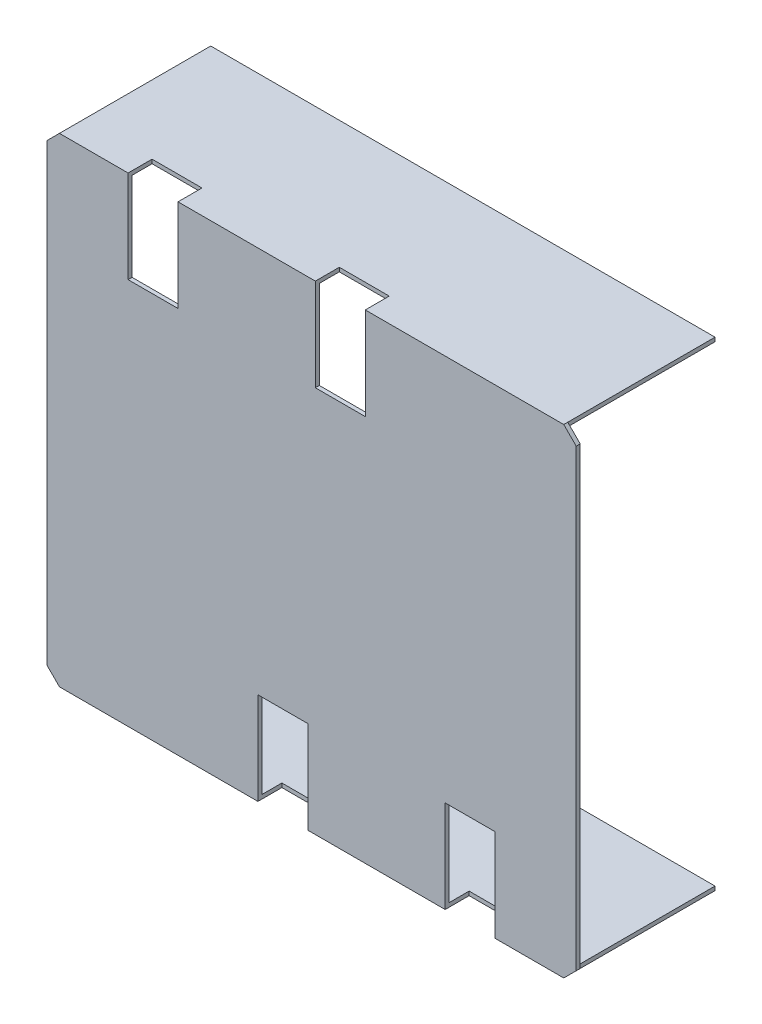
ISO-10303-21;
HEADER;
FILE_DESCRIPTION(('STEP AP214'),'2;1');
FILE_NAME('part.step','',(''),(''),'','','');
FILE_SCHEMA(('AUTOMOTIVE_DESIGN { 1 0 10303 214 1 1 1 1 }'));
ENDSEC;
DATA;
#1=APPLICATION_CONTEXT('core data for automotive mechanical design processes');
#2=APPLICATION_PROTOCOL_DEFINITION('international standard','automotive_design',2000,#1);
#3=PRODUCT_CONTEXT('',#1,'mechanical');
#4=PRODUCT('Part','Part','',(#3));
#5=PRODUCT_RELATED_PRODUCT_CATEGORY('part','',(#4));
#6=PRODUCT_DEFINITION_FORMATION('','',#4);
#7=PRODUCT_DEFINITION_CONTEXT('part definition',#1,'design');
#8=PRODUCT_DEFINITION('design','',#6,#7);
#9=PRODUCT_DEFINITION_SHAPE('','',#8);
#10=(LENGTH_UNIT() NAMED_UNIT(*) SI_UNIT(.MILLI.,.METRE.));
#11=(NAMED_UNIT(*) PLANE_ANGLE_UNIT() SI_UNIT($,.RADIAN.));
#12=(NAMED_UNIT(*) SI_UNIT($,.STERADIAN.) SOLID_ANGLE_UNIT());
#13=UNCERTAINTY_MEASURE_WITH_UNIT(LENGTH_MEASURE(1.E-05),#10,'distance_accuracy_value','');
#14=(GEOMETRIC_REPRESENTATION_CONTEXT(3) GLOBAL_UNCERTAINTY_ASSIGNED_CONTEXT((#13)) GLOBAL_UNIT_ASSIGNED_CONTEXT((#10,
#11,#12)) REPRESENTATION_CONTEXT('',''));
#15=CARTESIAN_POINT('',(0.,0.,0.));
#16=DIRECTION('',(0.,0.,1.));
#17=DIRECTION('',(1.,0.,0.));
#18=AXIS2_PLACEMENT_3D('',#15,#16,#17);
#19=CARTESIAN_POINT('',(-101.,-96.,87.6));
#20=DIRECTION('',(0.,1.,0.));
#21=DIRECTION('',(0.,0.,1.));
#22=AXIS2_PLACEMENT_3D('',#19,#20,#21);
#23=PLANE('',#22);
#24=DIRECTION('',(0.,0.,-1.));
#25=VECTOR('',#24,1.);
#26=CARTESIAN_POINT('',(53.5,-96.,87.6));
#27=LINE('',#26,#25);
#28=CARTESIAN_POINT('',(53.5,-96.,87.6));
#29=VERTEX_POINT('',#28);
#30=CARTESIAN_POINT('',(53.5,-96.,78.));
#31=VERTEX_POINT('',#30);
#32=EDGE_CURVE('E402',#29,#31,#27,.T.);
#33=ORIENTED_EDGE('',*,*,#32,.F.);
#34=DIRECTION('',(1.,0.,0.));
#35=VECTOR('',#34,1.);
#36=CARTESIAN_POINT('',(-101.,-96.,87.6));
#37=LINE('',#36,#35);
#38=CARTESIAN_POINT('',(-1.5,-96.,87.6));
#39=VERTEX_POINT('',#38);
#40=EDGE_CURVE('E480',#39,#29,#37,.T.);
#41=ORIENTED_EDGE('',*,*,#40,.F.);
#42=DIRECTION('',(0.,0.,1.));
#43=VECTOR('',#42,1.);
#44=CARTESIAN_POINT('',(-1.5,-96.,87.6));
#45=LINE('',#44,#43);
#46=CARTESIAN_POINT('',(-1.5,-96.,78.));
#47=VERTEX_POINT('',#46);
#48=EDGE_CURVE('E390',#47,#39,#45,.T.);
#49=ORIENTED_EDGE('',*,*,#48,.F.);
#50=DIRECTION('',(1.,0.,0.));
#51=VECTOR('',#50,1.);
#52=CARTESIAN_POINT('',(-101.,-96.,78.));
#53=LINE('',#52,#51);
#54=CARTESIAN_POINT('',(-21.5,-96.,78.));
#55=VERTEX_POINT('',#54);
#56=EDGE_CURVE('E384',#55,#47,#53,.T.);
#57=ORIENTED_EDGE('',*,*,#56,.F.);
#58=DIRECTION('',(0.,0.,-1.));
#59=VECTOR('',#58,1.);
#60=CARTESIAN_POINT('',(-21.5,-96.,87.6));
#61=LINE('',#60,#59);
#62=CARTESIAN_POINT('',(-21.5,-96.,87.6));
#63=VERTEX_POINT('',#62);
#64=EDGE_CURVE('E391',#63,#55,#61,.T.);
#65=ORIENTED_EDGE('',*,*,#64,.F.);
#66=CARTESIAN_POINT('',(-101.,-96.,87.6));
#67=VERTEX_POINT('',#66);
#68=EDGE_CURVE('E471',#67,#63,#37,.T.);
#69=ORIENTED_EDGE('',*,*,#68,.F.);
#70=DIRECTION('',(0.,0.,-1.));
#71=VECTOR('',#70,1.);
#72=CARTESIAN_POINT('',(-101.,-96.,87.6));
#73=LINE('',#72,#71);
#74=CARTESIAN_POINT('',(-101.,-96.,86.));
#75=VERTEX_POINT('',#74);
#76=EDGE_CURVE('E523',#67,#75,#73,.T.);
#77=ORIENTED_EDGE('',*,*,#76,.T.);
#78=DIRECTION('',(0.,0.,-1.));
#79=VECTOR('',#78,1.);
#80=CARTESIAN_POINT('',(-101.,-96.,86.));
#81=LINE('',#80,#79);
#82=CARTESIAN_POINT('',(-101.,-96.,27.));
#83=VERTEX_POINT('',#82);
#84=EDGE_CURVE('E401',#75,#83,#81,.T.);
#85=ORIENTED_EDGE('',*,*,#84,.T.);
#86=DIRECTION('',(1.,0.,0.));
#87=VECTOR('',#86,1.);
#88=CARTESIAN_POINT('',(-101.,-96.,27.));
#89=LINE('',#88,#87);
#90=CARTESIAN_POINT('',(101.,-96.,27.));
#91=VERTEX_POINT('',#90);
#92=EDGE_CURVE('E454',#83,#91,#89,.T.);
#93=ORIENTED_EDGE('',*,*,#92,.T.);
#94=DIRECTION('',(0.,0.,-1.));
#95=VECTOR('',#94,1.);
#96=CARTESIAN_POINT('',(101.,-96.,86.));
#97=LINE('',#96,#95);
#98=CARTESIAN_POINT('',(101.,-96.,86.));
#99=VERTEX_POINT('',#98);
#100=EDGE_CURVE('E439',#99,#91,#97,.T.);
#101=ORIENTED_EDGE('',*,*,#100,.F.);
#102=DIRECTION('',(0.,0.,-1.));
#103=VECTOR('',#102,1.);
#104=CARTESIAN_POINT('',(101.,-96.,87.6));
#105=LINE('',#104,#103);
#106=CARTESIAN_POINT('',(101.,-96.,87.6));
#107=VERTEX_POINT('',#106);
#108=EDGE_CURVE('E521',#107,#99,#105,.T.);
#109=ORIENTED_EDGE('',*,*,#108,.F.);
#110=CARTESIAN_POINT('',(73.5,-96.,87.6));
#111=VERTEX_POINT('',#110);
#112=EDGE_CURVE('E473',#111,#107,#37,.T.);
#113=ORIENTED_EDGE('',*,*,#112,.F.);
#114=DIRECTION('',(0.,0.,1.));
#115=VECTOR('',#114,1.);
#116=CARTESIAN_POINT('',(73.5,-96.,87.6));
#117=LINE('',#116,#115);
#118=CARTESIAN_POINT('',(73.5,-96.,78.));
#119=VERTEX_POINT('',#118);
#120=EDGE_CURVE('E400',#119,#111,#117,.T.);
#121=ORIENTED_EDGE('',*,*,#120,.F.);
#122=DIRECTION('',(1.,0.,0.));
#123=VECTOR('',#122,1.);
#124=CARTESIAN_POINT('',(-101.,-96.,78.));
#125=LINE('',#124,#123);
#126=EDGE_CURVE('E392',#31,#119,#125,.T.);
#127=ORIENTED_EDGE('',*,*,#126,.F.);
#128=EDGE_LOOP('',(#33,#41,#49,#57,#65,#69,#77,#85,#93,#101,#109,#113,#121,#127));
#129=FACE_BOUND('',#128,.T.);
#130=ADVANCED_FACE('F39',(#129),#23,.F.);
#131=CARTESIAN_POINT('',(101.,96.,87.6));
#132=DIRECTION('',(0.,-1.,0.));
#133=DIRECTION('',(0.,0.,-1.));
#134=AXIS2_PLACEMENT_3D('',#131,#132,#133);
#135=PLANE('',#134);
#136=DIRECTION('',(0.,0.,1.));
#137=VECTOR('',#136,1.);
#138=CARTESIAN_POINT('',(-73.5,96.,87.6));
#139=LINE('',#138,#137);
#140=CARTESIAN_POINT('',(-73.5,96.,78.));
#141=VERTEX_POINT('',#140);
#142=CARTESIAN_POINT('',(-73.5,96.,87.6));
#143=VERTEX_POINT('',#142);
#144=EDGE_CURVE('E382',#141,#143,#139,.T.);
#145=ORIENTED_EDGE('',*,*,#144,.F.);
#146=DIRECTION('',(-1.,0.,0.));
#147=VECTOR('',#146,1.);
#148=CARTESIAN_POINT('',(101.,96.,78.));
#149=LINE('',#148,#147);
#150=CARTESIAN_POINT('',(-53.5,96.,78.));
#151=VERTEX_POINT('',#150);
#152=EDGE_CURVE('E372',#151,#141,#149,.T.);
#153=ORIENTED_EDGE('',*,*,#152,.F.);
#154=DIRECTION('',(0.,0.,-1.));
#155=VECTOR('',#154,1.);
#156=CARTESIAN_POINT('',(-53.5,96.,87.6));
#157=LINE('',#156,#155);
#158=CARTESIAN_POINT('',(-53.5,96.,87.6));
#159=VERTEX_POINT('',#158);
#160=EDGE_CURVE('E380',#159,#151,#157,.T.);
#161=ORIENTED_EDGE('',*,*,#160,.F.);
#162=DIRECTION('',(-1.,0.,0.));
#163=VECTOR('',#162,1.);
#164=CARTESIAN_POINT('',(101.,96.,87.6));
#165=LINE('',#164,#163);
#166=CARTESIAN_POINT('',(1.5,96.,87.6));
#167=VERTEX_POINT('',#166);
#168=EDGE_CURVE('E303',#167,#159,#165,.T.);
#169=ORIENTED_EDGE('',*,*,#168,.F.);
#170=DIRECTION('',(0.,0.,1.));
#171=VECTOR('',#170,1.);
#172=CARTESIAN_POINT('',(1.5,96.,87.6));
#173=LINE('',#172,#171);
#174=CARTESIAN_POINT('',(1.5,96.,78.));
#175=VERTEX_POINT('',#174);
#176=EDGE_CURVE('E375',#175,#167,#173,.T.);
#177=ORIENTED_EDGE('',*,*,#176,.F.);
#178=DIRECTION('',(-1.,0.,0.));
#179=VECTOR('',#178,1.);
#180=CARTESIAN_POINT('',(101.,96.,78.));
#181=LINE('',#180,#179);
#182=CARTESIAN_POINT('',(21.5,96.,78.));
#183=VERTEX_POINT('',#182);
#184=EDGE_CURVE('E313',#183,#175,#181,.T.);
#185=ORIENTED_EDGE('',*,*,#184,.F.);
#186=DIRECTION('',(0.,0.,-1.));
#187=VECTOR('',#186,1.);
#188=CARTESIAN_POINT('',(21.5,96.,87.6));
#189=LINE('',#188,#187);
#190=CARTESIAN_POINT('',(21.5,96.,87.6));
#191=VERTEX_POINT('',#190);
#192=EDGE_CURVE('E368',#191,#183,#189,.T.);
#193=ORIENTED_EDGE('',*,*,#192,.F.);
#194=CARTESIAN_POINT('',(101.,96.,87.6));
#195=VERTEX_POINT('',#194);
#196=EDGE_CURVE('E483',#195,#191,#165,.T.);
#197=ORIENTED_EDGE('',*,*,#196,.F.);
#198=DIRECTION('',(0.,0.,-1.));
#199=VECTOR('',#198,1.);
#200=CARTESIAN_POINT('',(101.,96.,87.6));
#201=LINE('',#200,#199);
#202=CARTESIAN_POINT('',(101.,96.,86.));
#203=VERTEX_POINT('',#202);
#204=EDGE_CURVE('E515',#195,#203,#201,.T.);
#205=ORIENTED_EDGE('',*,*,#204,.T.);
#206=DIRECTION('',(0.,0.,-1.));
#207=VECTOR('',#206,1.);
#208=CARTESIAN_POINT('',(101.,96.,86.));
#209=LINE('',#208,#207);
#210=CARTESIAN_POINT('',(101.,96.,27.));
#211=VERTEX_POINT('',#210);
#212=EDGE_CURVE('E426',#203,#211,#209,.T.);
#213=ORIENTED_EDGE('',*,*,#212,.T.);
#214=DIRECTION('',(-1.,0.,0.));
#215=VECTOR('',#214,1.);
#216=CARTESIAN_POINT('',(101.,96.,27.));
#217=LINE('',#216,#215);
#218=CARTESIAN_POINT('',(-101.,96.,27.));
#219=VERTEX_POINT('',#218);
#220=EDGE_CURVE('E406',#211,#219,#217,.T.);
#221=ORIENTED_EDGE('',*,*,#220,.T.);
#222=DIRECTION('',(0.,0.,-1.));
#223=VECTOR('',#222,1.);
#224=CARTESIAN_POINT('',(-101.,96.,86.));
#225=LINE('',#224,#223);
#226=CARTESIAN_POINT('',(-101.,96.,86.));
#227=VERTEX_POINT('',#226);
#228=EDGE_CURVE('E416',#227,#219,#225,.T.);
#229=ORIENTED_EDGE('',*,*,#228,.F.);
#230=DIRECTION('',(0.,0.,-1.));
#231=VECTOR('',#230,1.);
#232=CARTESIAN_POINT('',(-101.,96.,87.6));
#233=LINE('',#232,#231);
#234=CARTESIAN_POINT('',(-101.,96.,87.6));
#235=VERTEX_POINT('',#234);
#236=EDGE_CURVE('E508',#235,#227,#233,.T.);
#237=ORIENTED_EDGE('',*,*,#236,.F.);
#238=EDGE_CURVE('E482',#143,#235,#165,.T.);
#239=ORIENTED_EDGE('',*,*,#238,.F.);
#240=EDGE_LOOP('',(#145,#153,#161,#169,#177,#185,#193,#197,#205,#213,#221,#229,#237,#239));
#241=FACE_BOUND('',#240,.T.);
#242=ADVANCED_FACE('F607',(#241),#135,.F.);
#243=CARTESIAN_POINT('',(0.,0.,86.));
#244=DIRECTION('',(0.,0.,1.));
#245=DIRECTION('',(1.,0.,0.));
#246=AXIS2_PLACEMENT_3D('',#243,#244,#245);
#247=PLANE('',#246);
#248=DIRECTION('',(0.,1.,0.));
#249=VECTOR('',#248,1.);
#250=CARTESIAN_POINT('',(-73.5,0.,86.));
#251=LINE('',#250,#249);
#252=CARTESIAN_POINT('',(-73.5,59.,86.));
#253=VERTEX_POINT('',#252);
#254=CARTESIAN_POINT('',(-73.5,94.4,86.));
#255=VERTEX_POINT('',#254);
#256=EDGE_CURVE('E378',#253,#255,#251,.T.);
#257=ORIENTED_EDGE('',*,*,#256,.F.);
#258=DIRECTION('',(-1.,0.,0.));
#259=VECTOR('',#258,1.);
#260=CARTESIAN_POINT('',(0.,59.,86.));
#261=LINE('',#260,#259);
#262=CARTESIAN_POINT('',(-53.5,59.,86.));
#263=VERTEX_POINT('',#262);
#264=EDGE_CURVE('E11',#263,#253,#261,.T.);
#265=ORIENTED_EDGE('',*,*,#264,.F.);
#266=DIRECTION('',(0.,-1.,0.));
#267=VECTOR('',#266,1.);
#268=CARTESIAN_POINT('',(-53.5,0.,86.));
#269=LINE('',#268,#267);
#270=CARTESIAN_POINT('',(-53.5,94.4,86.));
#271=VERTEX_POINT('',#270);
#272=EDGE_CURVE('E300',#271,#263,#269,.T.);
#273=ORIENTED_EDGE('',*,*,#272,.F.);
#274=DIRECTION('',(1.,0.,0.));
#275=VECTOR('',#274,1.);
#276=CARTESIAN_POINT('',(-101.,94.4,86.));
#277=LINE('',#276,#275);
#278=CARTESIAN_POINT('',(1.5,94.4,86.));
#279=VERTEX_POINT('',#278);
#280=EDGE_CURVE('E412',#271,#279,#277,.T.);
#281=ORIENTED_EDGE('',*,*,#280,.T.);
#282=DIRECTION('',(0.,1.,0.));
#283=VECTOR('',#282,1.);
#284=CARTESIAN_POINT('',(1.5,0.,86.));
#285=LINE('',#284,#283);
#286=CARTESIAN_POINT('',(1.5,59.,86.));
#287=VERTEX_POINT('',#286);
#288=EDGE_CURVE('E369',#287,#279,#285,.T.);
#289=ORIENTED_EDGE('',*,*,#288,.F.);
#290=DIRECTION('',(-1.,0.,0.));
#291=VECTOR('',#290,1.);
#292=CARTESIAN_POINT('',(0.,59.,86.));
#293=LINE('',#292,#291);
#294=CARTESIAN_POINT('',(21.5,59.,86.));
#295=VERTEX_POINT('',#294);
#296=EDGE_CURVE('E560',#295,#287,#293,.T.);
#297=ORIENTED_EDGE('',*,*,#296,.F.);
#298=DIRECTION('',(0.,-1.,0.));
#299=VECTOR('',#298,1.);
#300=CARTESIAN_POINT('',(21.5,0.,86.));
#301=LINE('',#300,#299);
#302=CARTESIAN_POINT('',(21.5,94.4,86.));
#303=VERTEX_POINT('',#302);
#304=EDGE_CURVE('E366',#303,#295,#301,.T.);
#305=ORIENTED_EDGE('',*,*,#304,.F.);
#306=CARTESIAN_POINT('',(101.,94.4,86.));
#307=VERTEX_POINT('',#306);
#308=EDGE_CURVE('E410',#303,#307,#277,.T.);
#309=ORIENTED_EDGE('',*,*,#308,.T.);
#310=DIRECTION('',(0.,1.,0.));
#311=VECTOR('',#310,1.);
#312=CARTESIAN_POINT('',(101.,94.4,86.));
#313=LINE('',#312,#311);
#314=EDGE_CURVE('E415',#307,#203,#313,.T.);
#315=ORIENTED_EDGE('',*,*,#314,.T.);
#316=DIRECTION('',(-0.707106781186546,0.707106781186548,0.));
#317=VECTOR('',#316,1.);
#318=CARTESIAN_POINT('',(106.,91.,86.));
#319=LINE('',#318,#317);
#320=CARTESIAN_POINT('',(106.,91.,86.));
#321=VERTEX_POINT('',#320);
#322=EDGE_CURVE('E498',#321,#203,#319,.T.);
#323=ORIENTED_EDGE('',*,*,#322,.F.);
#324=DIRECTION('',(0.,1.,0.));
#325=VECTOR('',#324,1.);
#326=CARTESIAN_POINT('',(106.,-91.,86.));
#327=LINE('',#326,#325);
#328=CARTESIAN_POINT('',(106.,-91.,86.));
#329=VERTEX_POINT('',#328);
#330=EDGE_CURVE('E496',#329,#321,#327,.T.);
#331=ORIENTED_EDGE('',*,*,#330,.F.);
#332=DIRECTION('',(0.707106781186546,0.707106781186548,0.));
#333=VECTOR('',#332,1.);
#334=CARTESIAN_POINT('',(101.,-96.,86.));
#335=LINE('',#334,#333);
#336=EDGE_CURVE('E494',#99,#329,#335,.T.);
#337=ORIENTED_EDGE('',*,*,#336,.F.);
#338=DIRECTION('',(0.,1.,0.));
#339=VECTOR('',#338,1.);
#340=CARTESIAN_POINT('',(101.,-96.,86.));
#341=LINE('',#340,#339);
#342=CARTESIAN_POINT('',(101.,-94.4,86.));
#343=VERTEX_POINT('',#342);
#344=EDGE_CURVE('E465',#99,#343,#341,.T.);
#345=ORIENTED_EDGE('',*,*,#344,.T.);
#346=DIRECTION('',(-1.,0.,0.));
#347=VECTOR('',#346,1.);
#348=CARTESIAN_POINT('',(101.,-94.4,86.));
#349=LINE('',#348,#347);
#350=CARTESIAN_POINT('',(73.5,-94.4,86.));
#351=VERTEX_POINT('',#350);
#352=EDGE_CURVE('E458',#343,#351,#349,.T.);
#353=ORIENTED_EDGE('',*,*,#352,.T.);
#354=DIRECTION('',(0.,-1.,0.));
#355=VECTOR('',#354,1.);
#356=CARTESIAN_POINT('',(73.5,0.,86.));
#357=LINE('',#356,#355);
#358=CARTESIAN_POINT('',(73.5,-59.,86.));
#359=VERTEX_POINT('',#358);
#360=EDGE_CURVE('E394',#359,#351,#357,.T.);
#361=ORIENTED_EDGE('',*,*,#360,.F.);
#362=DIRECTION('',(1.,0.,0.));
#363=VECTOR('',#362,1.);
#364=CARTESIAN_POINT('',(0.,-59.,86.));
#365=LINE('',#364,#363);
#366=CARTESIAN_POINT('',(53.5,-59.,86.));
#367=VERTEX_POINT('',#366);
#368=EDGE_CURVE('E50',#367,#359,#365,.T.);
#369=ORIENTED_EDGE('',*,*,#368,.F.);
#370=DIRECTION('',(0.,1.,0.));
#371=VECTOR('',#370,1.);
#372=CARTESIAN_POINT('',(53.5,0.,86.));
#373=LINE('',#372,#371);
#374=CARTESIAN_POINT('',(53.5,-94.4,86.));
#375=VERTEX_POINT('',#374);
#376=EDGE_CURVE('E398',#375,#367,#373,.T.);
#377=ORIENTED_EDGE('',*,*,#376,.F.);
#378=CARTESIAN_POINT('',(-1.5,-94.4,86.));
#379=VERTEX_POINT('',#378);
#380=EDGE_CURVE('E462',#375,#379,#349,.T.);
#381=ORIENTED_EDGE('',*,*,#380,.T.);
#382=DIRECTION('',(0.,-1.,0.));
#383=VECTOR('',#382,1.);
#384=CARTESIAN_POINT('',(-1.5,0.,86.));
#385=LINE('',#384,#383);
#386=CARTESIAN_POINT('',(-1.5,-59.,86.));
#387=VERTEX_POINT('',#386);
#388=EDGE_CURVE('E383',#387,#379,#385,.T.);
#389=ORIENTED_EDGE('',*,*,#388,.F.);
#390=DIRECTION('',(1.,0.,0.));
#391=VECTOR('',#390,1.);
#392=CARTESIAN_POINT('',(0.,-59.,86.));
#393=LINE('',#392,#391);
#394=CARTESIAN_POINT('',(-21.5,-59.,86.));
#395=VERTEX_POINT('',#394);
#396=EDGE_CURVE('E554',#395,#387,#393,.T.);
#397=ORIENTED_EDGE('',*,*,#396,.F.);
#398=DIRECTION('',(0.,1.,0.));
#399=VECTOR('',#398,1.);
#400=CARTESIAN_POINT('',(-21.5,0.,86.));
#401=LINE('',#400,#399);
#402=CARTESIAN_POINT('',(-21.5,-94.4,86.));
#403=VERTEX_POINT('',#402);
#404=EDGE_CURVE('E387',#403,#395,#401,.T.);
#405=ORIENTED_EDGE('',*,*,#404,.F.);
#406=CARTESIAN_POINT('',(-101.,-94.4,86.));
#407=VERTEX_POINT('',#406);
#408=EDGE_CURVE('E446',#403,#407,#349,.T.);
#409=ORIENTED_EDGE('',*,*,#408,.T.);
#410=DIRECTION('',(0.,-1.,0.));
#411=VECTOR('',#410,1.);
#412=CARTESIAN_POINT('',(-101.,-94.4,86.));
#413=LINE('',#412,#411);
#414=EDGE_CURVE('E451',#407,#75,#413,.T.);
#415=ORIENTED_EDGE('',*,*,#414,.T.);
#416=DIRECTION('',(0.707106781186546,-0.707106781186548,0.));
#417=VECTOR('',#416,1.);
#418=CARTESIAN_POINT('',(-106.,-91.,86.));
#419=LINE('',#418,#417);
#420=CARTESIAN_POINT('',(-106.,-91.,86.));
#421=VERTEX_POINT('',#420);
#422=EDGE_CURVE('E440',#421,#75,#419,.T.);
#423=ORIENTED_EDGE('',*,*,#422,.F.);
#424=DIRECTION('',(0.,-1.,0.));
#425=VECTOR('',#424,1.);
#426=CARTESIAN_POINT('',(-106.,91.,86.));
#427=LINE('',#426,#425);
#428=CARTESIAN_POINT('',(-106.,91.,86.));
#429=VERTEX_POINT('',#428);
#430=EDGE_CURVE('E475',#429,#421,#427,.T.);
#431=ORIENTED_EDGE('',*,*,#430,.F.);
#432=DIRECTION('',(-0.707106781186546,-0.707106781186548,0.));
#433=VECTOR('',#432,1.);
#434=CARTESIAN_POINT('',(-101.,96.,86.));
#435=LINE('',#434,#433);
#436=EDGE_CURVE('E501',#227,#429,#435,.T.);
#437=ORIENTED_EDGE('',*,*,#436,.F.);
#438=DIRECTION('',(0.,-1.,0.));
#439=VECTOR('',#438,1.);
#440=CARTESIAN_POINT('',(-101.,96.,86.));
#441=LINE('',#440,#439);
#442=CARTESIAN_POINT('',(-101.,94.4,86.));
#443=VERTEX_POINT('',#442);
#444=EDGE_CURVE('E404',#227,#443,#441,.T.);
#445=ORIENTED_EDGE('',*,*,#444,.T.);
#446=EDGE_CURVE('E407',#443,#255,#277,.T.);
#447=ORIENTED_EDGE('',*,*,#446,.T.);
#448=EDGE_LOOP('',(#257,#265,#273,#281,#289,#297,#305,#309,#315,#323,#331,#337,#345,#353,#361,
#369,#377,#381,#389,#397,#405,#409,#415,#423,#431,#437,#445,#447));
#449=FACE_BOUND('',#448,.T.);
#450=ADVANCED_FACE('F569',(#449),#247,.F.);
#451=CARTESIAN_POINT('',(101.,-94.4,86.));
#452=DIRECTION('',(0.,-1.,0.));
#453=DIRECTION('',(0.,0.,-1.));
#454=AXIS2_PLACEMENT_3D('',#451,#452,#453);
#455=PLANE('',#454);
#456=DIRECTION('',(0.,0.,1.));
#457=VECTOR('',#456,1.);
#458=CARTESIAN_POINT('',(53.5,-94.4,86.));
#459=LINE('',#458,#457);
#460=CARTESIAN_POINT('',(53.5,-94.4,78.));
#461=VERTEX_POINT('',#460);
#462=EDGE_CURVE('E551',#461,#375,#459,.T.);
#463=ORIENTED_EDGE('',*,*,#462,.F.);
#464=DIRECTION('',(-1.,0.,0.));
#465=VECTOR('',#464,1.);
#466=CARTESIAN_POINT('',(101.,-94.4,78.));
#467=LINE('',#466,#465);
#468=CARTESIAN_POINT('',(73.5,-94.4,78.));
#469=VERTEX_POINT('',#468);
#470=EDGE_CURVE('E547',#469,#461,#467,.T.);
#471=ORIENTED_EDGE('',*,*,#470,.F.);
#472=DIRECTION('',(0.,0.,-1.));
#473=VECTOR('',#472,1.);
#474=CARTESIAN_POINT('',(73.5,-94.4,86.));
#475=LINE('',#474,#473);
#476=EDGE_CURVE('E549',#351,#469,#475,.T.);
#477=ORIENTED_EDGE('',*,*,#476,.F.);
#478=ORIENTED_EDGE('',*,*,#352,.F.);
#479=DIRECTION('',(0.,0.,-1.));
#480=VECTOR('',#479,1.);
#481=CARTESIAN_POINT('',(101.,-94.4,86.));
#482=LINE('',#481,#480);
#483=CARTESIAN_POINT('',(101.,-94.4,27.));
#484=VERTEX_POINT('',#483);
#485=EDGE_CURVE('E442',#343,#484,#482,.T.);
#486=ORIENTED_EDGE('',*,*,#485,.T.);
#487=DIRECTION('',(-1.,0.,0.));
#488=VECTOR('',#487,1.);
#489=CARTESIAN_POINT('',(101.,-94.4,27.));
#490=LINE('',#489,#488);
#491=CARTESIAN_POINT('',(-101.,-94.4,27.));
#492=VERTEX_POINT('',#491);
#493=EDGE_CURVE('E448',#484,#492,#490,.T.);
#494=ORIENTED_EDGE('',*,*,#493,.T.);
#495=DIRECTION('',(0.,0.,-1.));
#496=VECTOR('',#495,1.);
#497=CARTESIAN_POINT('',(-101.,-94.4,86.));
#498=LINE('',#497,#496);
#499=EDGE_CURVE('E447',#407,#492,#498,.T.);
#500=ORIENTED_EDGE('',*,*,#499,.F.);
#501=ORIENTED_EDGE('',*,*,#408,.F.);
#502=DIRECTION('',(0.,0.,1.));
#503=VECTOR('',#502,1.);
#504=CARTESIAN_POINT('',(-21.5,-94.4,86.));
#505=LINE('',#504,#503);
#506=CARTESIAN_POINT('',(-21.5,-94.4,78.));
#507=VERTEX_POINT('',#506);
#508=EDGE_CURVE('E546',#507,#403,#505,.T.);
#509=ORIENTED_EDGE('',*,*,#508,.F.);
#510=DIRECTION('',(-1.,0.,0.));
#511=VECTOR('',#510,1.);
#512=CARTESIAN_POINT('',(101.,-94.4,78.));
#513=LINE('',#512,#511);
#514=CARTESIAN_POINT('',(-1.5,-94.4,78.));
#515=VERTEX_POINT('',#514);
#516=EDGE_CURVE('E541',#515,#507,#513,.T.);
#517=ORIENTED_EDGE('',*,*,#516,.F.);
#518=DIRECTION('',(0.,0.,-1.));
#519=VECTOR('',#518,1.);
#520=CARTESIAN_POINT('',(-1.5,-94.4,86.));
#521=LINE('',#520,#519);
#522=EDGE_CURVE('E542',#379,#515,#521,.T.);
#523=ORIENTED_EDGE('',*,*,#522,.F.);
#524=ORIENTED_EDGE('',*,*,#380,.F.);
#525=EDGE_LOOP('',(#463,#471,#477,#478,#486,#494,#500,#501,#509,#517,#523,#524));
#526=FACE_BOUND('',#525,.T.);
#527=ADVANCED_FACE('F577',(#526),#455,.F.);
#528=CARTESIAN_POINT('',(-101.,94.4,86.));
#529=DIRECTION('',(0.,1.,0.));
#530=DIRECTION('',(0.,0.,1.));
#531=AXIS2_PLACEMENT_3D('',#528,#529,#530);
#532=PLANE('',#531);
#533=DIRECTION('',(0.,0.,-1.));
#534=VECTOR('',#533,1.);
#535=CARTESIAN_POINT('',(-73.5,94.4,86.));
#536=LINE('',#535,#534);
#537=CARTESIAN_POINT('',(-73.5,94.4,78.));
#538=VERTEX_POINT('',#537);
#539=EDGE_CURVE('E536',#255,#538,#536,.T.);
#540=ORIENTED_EDGE('',*,*,#539,.F.);
#541=ORIENTED_EDGE('',*,*,#446,.F.);
#542=DIRECTION('',(0.,0.,-1.));
#543=VECTOR('',#542,1.);
#544=CARTESIAN_POINT('',(-101.,94.4,86.));
#545=LINE('',#544,#543);
#546=CARTESIAN_POINT('',(-101.,94.4,27.));
#547=VERTEX_POINT('',#546);
#548=EDGE_CURVE('E432',#443,#547,#545,.T.);
#549=ORIENTED_EDGE('',*,*,#548,.T.);
#550=DIRECTION('',(1.,0.,0.));
#551=VECTOR('',#550,1.);
#552=CARTESIAN_POINT('',(-101.,94.4,27.));
#553=LINE('',#552,#551);
#554=CARTESIAN_POINT('',(101.,94.4,27.));
#555=VERTEX_POINT('',#554);
#556=EDGE_CURVE('E419',#547,#555,#553,.T.);
#557=ORIENTED_EDGE('',*,*,#556,.T.);
#558=DIRECTION('',(0.,0.,-1.));
#559=VECTOR('',#558,1.);
#560=CARTESIAN_POINT('',(101.,94.4,86.));
#561=LINE('',#560,#559);
#562=EDGE_CURVE('E431',#307,#555,#561,.T.);
#563=ORIENTED_EDGE('',*,*,#562,.F.);
#564=ORIENTED_EDGE('',*,*,#308,.F.);
#565=DIRECTION('',(0.,0.,1.));
#566=VECTOR('',#565,1.);
#567=CARTESIAN_POINT('',(21.5,94.4,86.));
#568=LINE('',#567,#566);
#569=CARTESIAN_POINT('',(21.5,94.4,78.));
#570=VERTEX_POINT('',#569);
#571=EDGE_CURVE('E528',#570,#303,#568,.T.);
#572=ORIENTED_EDGE('',*,*,#571,.F.);
#573=DIRECTION('',(1.,0.,0.));
#574=VECTOR('',#573,1.);
#575=CARTESIAN_POINT('',(-101.,94.4,78.));
#576=LINE('',#575,#574);
#577=CARTESIAN_POINT('',(1.5,94.4,78.));
#578=VERTEX_POINT('',#577);
#579=EDGE_CURVE('E530',#578,#570,#576,.T.);
#580=ORIENTED_EDGE('',*,*,#579,.F.);
#581=DIRECTION('',(0.,0.,-1.));
#582=VECTOR('',#581,1.);
#583=CARTESIAN_POINT('',(1.5,94.4,86.));
#584=LINE('',#583,#582);
#585=EDGE_CURVE('E532',#279,#578,#584,.T.);
#586=ORIENTED_EDGE('',*,*,#585,.F.);
#587=ORIENTED_EDGE('',*,*,#280,.F.);
#588=DIRECTION('',(0.,0.,1.));
#589=VECTOR('',#588,1.);
#590=CARTESIAN_POINT('',(-53.5,94.4,86.));
#591=LINE('',#590,#589);
#592=CARTESIAN_POINT('',(-53.5,94.4,78.));
#593=VERTEX_POINT('',#592);
#594=EDGE_CURVE('E538',#593,#271,#591,.T.);
#595=ORIENTED_EDGE('',*,*,#594,.F.);
#596=DIRECTION('',(1.,0.,0.));
#597=VECTOR('',#596,1.);
#598=CARTESIAN_POINT('',(-101.,94.4,78.));
#599=LINE('',#598,#597);
#600=EDGE_CURVE('E534',#538,#593,#599,.T.);
#601=ORIENTED_EDGE('',*,*,#600,.F.);
#602=EDGE_LOOP('',(#540,#541,#549,#557,#563,#564,#572,#580,#586,#587,#595,#601));
#603=FACE_BOUND('',#602,.T.);
#604=ADVANCED_FACE('F647',(#603),#532,.F.);
#605=CARTESIAN_POINT('',(-106.,-91.,87.6));
#606=DIRECTION('',(0.707106781186549,0.707106781186547,0.));
#607=DIRECTION('',(-0.707106781186547,0.707106781186549,0.));
#608=AXIS2_PLACEMENT_3D('',#605,#606,#607);
#609=PLANE('',#608);
#610=ORIENTED_EDGE('',*,*,#422,.T.);
#611=ORIENTED_EDGE('',*,*,#76,.F.);
#612=DIRECTION('',(0.707106781186546,-0.707106781186548,0.));
#613=VECTOR('',#612,1.);
#614=CARTESIAN_POINT('',(-106.,-91.,87.6));
#615=LINE('',#614,#613);
#616=CARTESIAN_POINT('',(-106.,-91.,87.6));
#617=VERTEX_POINT('',#616);
#618=EDGE_CURVE('E466',#617,#67,#615,.T.);
#619=ORIENTED_EDGE('',*,*,#618,.F.);
#620=DIRECTION('',(0.,0.,-1.));
#621=VECTOR('',#620,1.);
#622=CARTESIAN_POINT('',(-106.,-91.,87.6));
#623=LINE('',#622,#621);
#624=EDGE_CURVE('E493',#617,#421,#623,.T.);
#625=ORIENTED_EDGE('',*,*,#624,.T.);
#626=EDGE_LOOP('',(#610,#611,#619,#625));
#627=FACE_BOUND('',#626,.T.);
#628=ADVANCED_FACE('F41',(#627),#609,.F.);
#629=CARTESIAN_POINT('',(101.,-96.,87.6));
#630=DIRECTION('',(-0.707106781186549,0.707106781186547,0.));
#631=DIRECTION('',(-0.707106781186547,-0.707106781186549,0.));
#632=AXIS2_PLACEMENT_3D('',#629,#630,#631);
#633=PLANE('',#632);
#634=ORIENTED_EDGE('',*,*,#336,.T.);
#635=DIRECTION('',(0.,0.,-1.));
#636=VECTOR('',#635,1.);
#637=CARTESIAN_POINT('',(106.,-91.,87.6));
#638=LINE('',#637,#636);
#639=CARTESIAN_POINT('',(106.,-91.,87.6));
#640=VERTEX_POINT('',#639);
#641=EDGE_CURVE('E516',#640,#329,#638,.T.);
#642=ORIENTED_EDGE('',*,*,#641,.F.);
#643=DIRECTION('',(0.707106781186546,0.707106781186548,0.));
#644=VECTOR('',#643,1.);
#645=CARTESIAN_POINT('',(101.,-96.,87.6));
#646=LINE('',#645,#644);
#647=EDGE_CURVE('E476',#107,#640,#646,.T.);
#648=ORIENTED_EDGE('',*,*,#647,.F.);
#649=ORIENTED_EDGE('',*,*,#108,.T.);
#650=EDGE_LOOP('',(#634,#642,#648,#649));
#651=FACE_BOUND('',#650,.T.);
#652=ADVANCED_FACE('F618',(#651),#633,.F.);
#653=CARTESIAN_POINT('',(106.,-91.,87.6));
#654=DIRECTION('',(-1.,0.,0.));
#655=DIRECTION('',(0.,0.,1.));
#656=AXIS2_PLACEMENT_3D('',#653,#654,#655);
#657=PLANE('',#656);
#658=ORIENTED_EDGE('',*,*,#330,.T.);
#659=DIRECTION('',(0.,0.,-1.));
#660=VECTOR('',#659,1.);
#661=CARTESIAN_POINT('',(106.,91.,87.6));
#662=LINE('',#661,#660);
#663=CARTESIAN_POINT('',(106.,91.,87.6));
#664=VERTEX_POINT('',#663);
#665=EDGE_CURVE('E513',#664,#321,#662,.T.);
#666=ORIENTED_EDGE('',*,*,#665,.F.);
#667=DIRECTION('',(0.,1.,0.));
#668=VECTOR('',#667,1.);
#669=CARTESIAN_POINT('',(106.,-91.,87.6));
#670=LINE('',#669,#668);
#671=EDGE_CURVE('E478',#640,#664,#670,.T.);
#672=ORIENTED_EDGE('',*,*,#671,.F.);
#673=ORIENTED_EDGE('',*,*,#641,.T.);
#674=EDGE_LOOP('',(#658,#666,#672,#673));
#675=FACE_BOUND('',#674,.T.);
#676=ADVANCED_FACE('F620',(#675),#657,.F.);
#677=CARTESIAN_POINT('',(106.,91.,87.6));
#678=DIRECTION('',(-0.707106781186549,-0.707106781186547,0.));
#679=DIRECTION('',(0.707106781186547,-0.707106781186549,0.));
#680=AXIS2_PLACEMENT_3D('',#677,#678,#679);
#681=PLANE('',#680);
#682=ORIENTED_EDGE('',*,*,#322,.T.);
#683=ORIENTED_EDGE('',*,*,#204,.F.);
#684=DIRECTION('',(-0.707106781186546,0.707106781186548,0.));
#685=VECTOR('',#684,1.);
#686=CARTESIAN_POINT('',(106.,91.,87.6));
#687=LINE('',#686,#685);
#688=EDGE_CURVE('E481',#664,#195,#687,.T.);
#689=ORIENTED_EDGE('',*,*,#688,.F.);
#690=ORIENTED_EDGE('',*,*,#665,.T.);
#691=EDGE_LOOP('',(#682,#683,#689,#690));
#692=FACE_BOUND('',#691,.T.);
#693=ADVANCED_FACE('F621',(#692),#681,.F.);
#694=CARTESIAN_POINT('',(-101.,96.,87.6));
#695=DIRECTION('',(0.707106781186549,-0.707106781186547,0.));
#696=DIRECTION('',(0.707106781186547,0.707106781186549,0.));
#697=AXIS2_PLACEMENT_3D('',#694,#695,#696);
#698=PLANE('',#697);
#699=ORIENTED_EDGE('',*,*,#436,.T.);
#700=DIRECTION('',(0.,0.,-1.));
#701=VECTOR('',#700,1.);
#702=CARTESIAN_POINT('',(-106.,91.,87.6));
#703=LINE('',#702,#701);
#704=CARTESIAN_POINT('',(-106.,91.,87.6));
#705=VERTEX_POINT('',#704);
#706=EDGE_CURVE('E506',#705,#429,#703,.T.);
#707=ORIENTED_EDGE('',*,*,#706,.F.);
#708=DIRECTION('',(-0.707106781186546,-0.707106781186548,0.));
#709=VECTOR('',#708,1.);
#710=CARTESIAN_POINT('',(-101.,96.,87.6));
#711=LINE('',#710,#709);
#712=EDGE_CURVE('E487',#235,#705,#711,.T.);
#713=ORIENTED_EDGE('',*,*,#712,.F.);
#714=ORIENTED_EDGE('',*,*,#236,.T.);
#715=EDGE_LOOP('',(#699,#707,#713,#714));
#716=FACE_BOUND('',#715,.T.);
#717=ADVANCED_FACE('F626',(#716),#698,.F.);
#718=CARTESIAN_POINT('',(-106.,91.,87.6));
#719=DIRECTION('',(1.,0.,0.));
#720=DIRECTION('',(0.,0.,-1.));
#721=AXIS2_PLACEMENT_3D('',#718,#719,#720);
#722=PLANE('',#721);
#723=ORIENTED_EDGE('',*,*,#430,.T.);
#724=ORIENTED_EDGE('',*,*,#624,.F.);
#725=DIRECTION('',(0.,-1.,0.));
#726=VECTOR('',#725,1.);
#727=CARTESIAN_POINT('',(-106.,91.,87.6));
#728=LINE('',#727,#726);
#729=EDGE_CURVE('E490',#705,#617,#728,.T.);
#730=ORIENTED_EDGE('',*,*,#729,.F.);
#731=ORIENTED_EDGE('',*,*,#706,.T.);
#732=EDGE_LOOP('',(#723,#724,#730,#731));
#733=FACE_BOUND('',#732,.T.);
#734=ADVANCED_FACE('F631',(#733),#722,.F.);
#735=CARTESIAN_POINT('',(0.,0.,87.6));
#736=DIRECTION('',(0.,0.,1.));
#737=DIRECTION('',(1.,0.,0.));
#738=AXIS2_PLACEMENT_3D('',#735,#736,#737);
#739=PLANE('',#738);
#740=DIRECTION('',(0.,-1.,0.));
#741=VECTOR('',#740,1.);
#742=CARTESIAN_POINT('',(-73.5,97.,87.6));
#743=LINE('',#742,#741);
#744=CARTESIAN_POINT('',(-73.5,59.,87.6));
#745=VERTEX_POINT('',#744);
#746=EDGE_CURVE('E293',#143,#745,#743,.T.);
#747=ORIENTED_EDGE('',*,*,#746,.F.);
#748=ORIENTED_EDGE('',*,*,#238,.T.);
#749=ORIENTED_EDGE('',*,*,#712,.T.);
#750=ORIENTED_EDGE('',*,*,#729,.T.);
#751=ORIENTED_EDGE('',*,*,#618,.T.);
#752=ORIENTED_EDGE('',*,*,#68,.T.);
#753=DIRECTION('',(0.,-1.,0.));
#754=VECTOR('',#753,1.);
#755=CARTESIAN_POINT('',(-21.5,-59.,87.6));
#756=LINE('',#755,#754);
#757=CARTESIAN_POINT('',(-21.5,-59.,87.6));
#758=VERTEX_POINT('',#757);
#759=EDGE_CURVE('E357',#758,#63,#756,.T.);
#760=ORIENTED_EDGE('',*,*,#759,.F.);
#761=DIRECTION('',(-1.,0.,0.));
#762=VECTOR('',#761,1.);
#763=CARTESIAN_POINT('',(-1.5,-59.,87.6));
#764=LINE('',#763,#762);
#765=CARTESIAN_POINT('',(-1.5,-59.,87.6));
#766=VERTEX_POINT('',#765);
#767=EDGE_CURVE('E353',#766,#758,#764,.T.);
#768=ORIENTED_EDGE('',*,*,#767,.F.);
#769=DIRECTION('',(0.,1.,0.));
#770=VECTOR('',#769,1.);
#771=CARTESIAN_POINT('',(-1.5,-97.,87.6));
#772=LINE('',#771,#770);
#773=EDGE_CURVE('E363',#39,#766,#772,.T.);
#774=ORIENTED_EDGE('',*,*,#773,.F.);
#775=ORIENTED_EDGE('',*,*,#40,.T.);
#776=DIRECTION('',(0.,-1.,0.));
#777=VECTOR('',#776,1.);
#778=CARTESIAN_POINT('',(53.5,-59.,87.6));
#779=LINE('',#778,#777);
#780=CARTESIAN_POINT('',(53.5,-59.,87.6));
#781=VERTEX_POINT('',#780);
#782=EDGE_CURVE('E321',#781,#29,#779,.T.);
#783=ORIENTED_EDGE('',*,*,#782,.F.);
#784=DIRECTION('',(-1.,0.,0.));
#785=VECTOR('',#784,1.);
#786=CARTESIAN_POINT('',(73.5,-59.,87.6));
#787=LINE('',#786,#785);
#788=CARTESIAN_POINT('',(73.5,-59.,87.6));
#789=VERTEX_POINT('',#788);
#790=EDGE_CURVE('E318',#789,#781,#787,.T.);
#791=ORIENTED_EDGE('',*,*,#790,.F.);
#792=DIRECTION('',(0.,1.,0.));
#793=VECTOR('',#792,1.);
#794=CARTESIAN_POINT('',(73.5,-97.,87.6));
#795=LINE('',#794,#793);
#796=EDGE_CURVE('E330',#111,#789,#795,.T.);
#797=ORIENTED_EDGE('',*,*,#796,.F.);
#798=ORIENTED_EDGE('',*,*,#112,.T.);
#799=ORIENTED_EDGE('',*,*,#647,.T.);
#800=ORIENTED_EDGE('',*,*,#671,.T.);
#801=ORIENTED_EDGE('',*,*,#688,.T.);
#802=ORIENTED_EDGE('',*,*,#196,.T.);
#803=DIRECTION('',(0.,1.,0.));
#804=VECTOR('',#803,1.);
#805=CARTESIAN_POINT('',(21.5,59.,87.6));
#806=LINE('',#805,#804);
#807=CARTESIAN_POINT('',(21.5,59.,87.6));
#808=VERTEX_POINT('',#807);
#809=EDGE_CURVE('E340',#808,#191,#806,.T.);
#810=ORIENTED_EDGE('',*,*,#809,.F.);
#811=DIRECTION('',(1.,0.,0.));
#812=VECTOR('',#811,1.);
#813=CARTESIAN_POINT('',(1.5,59.,87.6));
#814=LINE('',#813,#812);
#815=CARTESIAN_POINT('',(1.5,59.,87.6));
#816=VERTEX_POINT('',#815);
#817=EDGE_CURVE('E342',#816,#808,#814,.T.);
#818=ORIENTED_EDGE('',*,*,#817,.F.);
#819=DIRECTION('',(0.,-1.,0.));
#820=VECTOR('',#819,1.);
#821=CARTESIAN_POINT('',(1.5,97.,87.6));
#822=LINE('',#821,#820);
#823=EDGE_CURVE('E343',#167,#816,#822,.T.);
#824=ORIENTED_EDGE('',*,*,#823,.F.);
#825=ORIENTED_EDGE('',*,*,#168,.T.);
#826=DIRECTION('',(0.,1.,0.));
#827=VECTOR('',#826,1.);
#828=CARTESIAN_POINT('',(-53.5,59.,87.6));
#829=LINE('',#828,#827);
#830=CARTESIAN_POINT('',(-53.5,59.,87.6));
#831=VERTEX_POINT('',#830);
#832=EDGE_CURVE('E289',#831,#159,#829,.T.);
#833=ORIENTED_EDGE('',*,*,#832,.F.);
#834=DIRECTION('',(1.,0.,0.));
#835=VECTOR('',#834,1.);
#836=CARTESIAN_POINT('',(-73.5,59.,87.6));
#837=LINE('',#836,#835);
#838=EDGE_CURVE('E285',#745,#831,#837,.T.);
#839=ORIENTED_EDGE('',*,*,#838,.F.);
#840=EDGE_LOOP('',(#747,#748,#749,#750,#751,#752,#760,#768,#774,#775,#783,#791,#797,#798,#799,
#800,#801,#802,#810,#818,#824,#825,#833,#839));
#841=FACE_BOUND('',#840,.T.);
#842=ADVANCED_FACE('F297',(#841),#739,.T.);
#843=CARTESIAN_POINT('',(-101.,-94.4,86.));
#844=DIRECTION('',(1.,0.,0.));
#845=DIRECTION('',(0.,0.,-1.));
#846=AXIS2_PLACEMENT_3D('',#843,#844,#845);
#847=PLANE('',#846);
#848=DIRECTION('',(0.,-1.,0.));
#849=VECTOR('',#848,1.);
#850=CARTESIAN_POINT('',(-101.,-94.4,27.));
#851=LINE('',#850,#849);
#852=EDGE_CURVE('E423',#492,#83,#851,.T.);
#853=ORIENTED_EDGE('',*,*,#852,.T.);
#854=ORIENTED_EDGE('',*,*,#84,.F.);
#855=ORIENTED_EDGE('',*,*,#414,.F.);
#856=ORIENTED_EDGE('',*,*,#499,.T.);
#857=EDGE_LOOP('',(#853,#854,#855,#856));
#858=FACE_BOUND('',#857,.T.);
#859=ADVANCED_FACE('F639',(#858),#847,.F.);
#860=CARTESIAN_POINT('',(101.,-96.,86.));
#861=DIRECTION('',(-1.,0.,0.));
#862=DIRECTION('',(0.,0.,1.));
#863=AXIS2_PLACEMENT_3D('',#860,#861,#862);
#864=PLANE('',#863);
#865=DIRECTION('',(0.,1.,0.));
#866=VECTOR('',#865,1.);
#867=CARTESIAN_POINT('',(101.,-96.,27.));
#868=LINE('',#867,#866);
#869=EDGE_CURVE('E455',#91,#484,#868,.T.);
#870=ORIENTED_EDGE('',*,*,#869,.T.);
#871=ORIENTED_EDGE('',*,*,#485,.F.);
#872=ORIENTED_EDGE('',*,*,#344,.F.);
#873=ORIENTED_EDGE('',*,*,#100,.T.);
#874=EDGE_LOOP('',(#870,#871,#872,#873));
#875=FACE_BOUND('',#874,.T.);
#876=ADVANCED_FACE('F643',(#875),#864,.F.);
#877=CARTESIAN_POINT('',(0.,0.,27.));
#878=DIRECTION('',(0.,0.,1.));
#879=DIRECTION('',(1.,0.,0.));
#880=AXIS2_PLACEMENT_3D('',#877,#878,#879);
#881=PLANE('',#880);
#882=ORIENTED_EDGE('',*,*,#852,.F.);
#883=ORIENTED_EDGE('',*,*,#493,.F.);
#884=ORIENTED_EDGE('',*,*,#869,.F.);
#885=ORIENTED_EDGE('',*,*,#92,.F.);
#886=EDGE_LOOP('',(#882,#883,#884,#885));
#887=FACE_BOUND('',#886,.T.);
#888=ADVANCED_FACE('F642',(#887),#881,.F.);
#889=CARTESIAN_POINT('',(-101.,96.,86.));
#890=DIRECTION('',(1.,0.,0.));
#891=DIRECTION('',(0.,0.,-1.));
#892=AXIS2_PLACEMENT_3D('',#889,#890,#891);
#893=PLANE('',#892);
#894=DIRECTION('',(0.,-1.,0.));
#895=VECTOR('',#894,1.);
#896=CARTESIAN_POINT('',(-101.,96.,27.));
#897=LINE('',#896,#895);
#898=EDGE_CURVE('E420',#219,#547,#897,.T.);
#899=ORIENTED_EDGE('',*,*,#898,.T.);
#900=ORIENTED_EDGE('',*,*,#548,.F.);
#901=ORIENTED_EDGE('',*,*,#444,.F.);
#902=ORIENTED_EDGE('',*,*,#228,.T.);
#903=EDGE_LOOP('',(#899,#900,#901,#902));
#904=FACE_BOUND('',#903,.T.);
#905=ADVANCED_FACE('F641',(#904),#893,.F.);
#906=CARTESIAN_POINT('',(101.,94.4,86.));
#907=DIRECTION('',(-1.,0.,0.));
#908=DIRECTION('',(0.,0.,1.));
#909=AXIS2_PLACEMENT_3D('',#906,#907,#908);
#910=PLANE('',#909);
#911=DIRECTION('',(0.,1.,0.));
#912=VECTOR('',#911,1.);
#913=CARTESIAN_POINT('',(101.,94.4,27.));
#914=LINE('',#913,#912);
#915=EDGE_CURVE('E421',#555,#211,#914,.T.);
#916=ORIENTED_EDGE('',*,*,#915,.T.);
#917=ORIENTED_EDGE('',*,*,#212,.F.);
#918=ORIENTED_EDGE('',*,*,#314,.F.);
#919=ORIENTED_EDGE('',*,*,#562,.T.);
#920=EDGE_LOOP('',(#916,#917,#918,#919));
#921=FACE_BOUND('',#920,.T.);
#922=ADVANCED_FACE('F657',(#921),#910,.F.);
#923=CARTESIAN_POINT('',(0.,0.,27.));
#924=DIRECTION('',(0.,0.,1.));
#925=DIRECTION('',(1.,0.,0.));
#926=AXIS2_PLACEMENT_3D('',#923,#924,#925);
#927=PLANE('',#926);
#928=ORIENTED_EDGE('',*,*,#898,.F.);
#929=ORIENTED_EDGE('',*,*,#220,.F.);
#930=ORIENTED_EDGE('',*,*,#915,.F.);
#931=ORIENTED_EDGE('',*,*,#556,.F.);
#932=EDGE_LOOP('',(#928,#929,#930,#931));
#933=FACE_BOUND('',#932,.T.);
#934=ADVANCED_FACE('F663',(#933),#927,.F.);
#935=CARTESIAN_POINT('',(1.5,59.,87.6));
#936=DIRECTION('',(0.,1.,0.));
#937=DIRECTION('',(0.,0.,1.));
#938=AXIS2_PLACEMENT_3D('',#935,#936,#937);
#939=PLANE('',#938);
#940=ORIENTED_EDGE('',*,*,#296,.T.);
#941=DIRECTION('',(0.,0.,-1.));
#942=VECTOR('',#941,1.);
#943=CARTESIAN_POINT('',(1.5,59.,87.6));
#944=LINE('',#943,#942);
#945=EDGE_CURVE('E329',#816,#287,#944,.T.);
#946=ORIENTED_EDGE('',*,*,#945,.F.);
#947=ORIENTED_EDGE('',*,*,#817,.T.);
#948=DIRECTION('',(0.,0.,-1.));
#949=VECTOR('',#948,1.);
#950=CARTESIAN_POINT('',(21.5,59.,87.6));
#951=LINE('',#950,#949);
#952=EDGE_CURVE('E332',#808,#295,#951,.T.);
#953=ORIENTED_EDGE('',*,*,#952,.T.);
#954=EDGE_LOOP('',(#940,#946,#947,#953));
#955=FACE_BOUND('',#954,.T.);
#956=ADVANCED_FACE('F666',(#955),#939,.T.);
#957=CARTESIAN_POINT('',(1.5,97.,87.6));
#958=DIRECTION('',(1.,0.,0.));
#959=DIRECTION('',(0.,0.,-1.));
#960=AXIS2_PLACEMENT_3D('',#957,#958,#959);
#961=PLANE('',#960);
#962=ORIENTED_EDGE('',*,*,#176,.T.);
#963=ORIENTED_EDGE('',*,*,#823,.T.);
#964=ORIENTED_EDGE('',*,*,#945,.T.);
#965=ORIENTED_EDGE('',*,*,#288,.T.);
#966=ORIENTED_EDGE('',*,*,#585,.T.);
#967=DIRECTION('',(0.,-1.,0.));
#968=VECTOR('',#967,1.);
#969=CARTESIAN_POINT('',(1.5,97.,78.));
#970=LINE('',#969,#968);
#971=EDGE_CURVE('E320',#175,#578,#970,.T.);
#972=ORIENTED_EDGE('',*,*,#971,.F.);
#973=EDGE_LOOP('',(#962,#963,#964,#965,#966,#972));
#974=FACE_BOUND('',#973,.T.);
#975=ADVANCED_FACE('F692',(#974),#961,.T.);
#976=CARTESIAN_POINT('',(21.5,59.,87.6));
#977=DIRECTION('',(-1.,0.,0.));
#978=DIRECTION('',(0.,0.,1.));
#979=AXIS2_PLACEMENT_3D('',#976,#977,#978);
#980=PLANE('',#979);
#981=ORIENTED_EDGE('',*,*,#192,.T.);
#982=DIRECTION('',(0.,1.,0.));
#983=VECTOR('',#982,1.);
#984=CARTESIAN_POINT('',(21.5,59.,78.));
#985=LINE('',#984,#983);
#986=EDGE_CURVE('E336',#570,#183,#985,.T.);
#987=ORIENTED_EDGE('',*,*,#986,.F.);
#988=ORIENTED_EDGE('',*,*,#571,.T.);
#989=ORIENTED_EDGE('',*,*,#304,.T.);
#990=ORIENTED_EDGE('',*,*,#952,.F.);
#991=ORIENTED_EDGE('',*,*,#809,.T.);
#992=EDGE_LOOP('',(#981,#987,#988,#989,#990,#991));
#993=FACE_BOUND('',#992,.T.);
#994=ADVANCED_FACE('F687',(#993),#980,.T.);
#995=CARTESIAN_POINT('',(0.,0.,78.));
#996=DIRECTION('',(0.,0.,1.));
#997=DIRECTION('',(1.,0.,0.));
#998=AXIS2_PLACEMENT_3D('',#995,#996,#997);
#999=PLANE('',#998);
#1000=ORIENTED_EDGE('',*,*,#184,.T.);
#1001=ORIENTED_EDGE('',*,*,#971,.T.);
#1002=ORIENTED_EDGE('',*,*,#579,.T.);
#1003=ORIENTED_EDGE('',*,*,#986,.T.);
#1004=EDGE_LOOP('',(#1000,#1001,#1002,#1003));
#1005=FACE_BOUND('',#1004,.T.);
#1006=ADVANCED_FACE('F690',(#1005),#999,.T.);
#1007=CARTESIAN_POINT('',(-73.5,59.,87.6));
#1008=DIRECTION('',(0.,1.,0.));
#1009=DIRECTION('',(0.,0.,1.));
#1010=AXIS2_PLACEMENT_3D('',#1007,#1008,#1009);
#1011=PLANE('',#1010);
#1012=ORIENTED_EDGE('',*,*,#264,.T.);
#1013=DIRECTION('',(0.,0.,-1.));
#1014=VECTOR('',#1013,1.);
#1015=CARTESIAN_POINT('',(-73.5,59.,87.6));
#1016=LINE('',#1015,#1014);
#1017=EDGE_CURVE('E52',#745,#253,#1016,.T.);
#1018=ORIENTED_EDGE('',*,*,#1017,.F.);
#1019=ORIENTED_EDGE('',*,*,#838,.T.);
#1020=DIRECTION('',(0.,0.,-1.));
#1021=VECTOR('',#1020,1.);
#1022=CARTESIAN_POINT('',(-53.5,59.,87.6));
#1023=LINE('',#1022,#1021);
#1024=EDGE_CURVE('E284',#831,#263,#1023,.T.);
#1025=ORIENTED_EDGE('',*,*,#1024,.T.);
#1026=EDGE_LOOP('',(#1012,#1018,#1019,#1025));
#1027=FACE_BOUND('',#1026,.T.);
#1028=ADVANCED_FACE('F283',(#1027),#1011,.T.);
#1029=CARTESIAN_POINT('',(-73.5,97.,87.6));
#1030=DIRECTION('',(1.,0.,0.));
#1031=DIRECTION('',(0.,0.,-1.));
#1032=AXIS2_PLACEMENT_3D('',#1029,#1030,#1031);
#1033=PLANE('',#1032);
#1034=ORIENTED_EDGE('',*,*,#144,.T.);
#1035=ORIENTED_EDGE('',*,*,#746,.T.);
#1036=ORIENTED_EDGE('',*,*,#1017,.T.);
#1037=ORIENTED_EDGE('',*,*,#256,.T.);
#1038=ORIENTED_EDGE('',*,*,#539,.T.);
#1039=DIRECTION('',(0.,-1.,0.));
#1040=VECTOR('',#1039,1.);
#1041=CARTESIAN_POINT('',(-73.5,97.,78.));
#1042=LINE('',#1041,#1040);
#1043=EDGE_CURVE('E310',#141,#538,#1042,.T.);
#1044=ORIENTED_EDGE('',*,*,#1043,.F.);
#1045=EDGE_LOOP('',(#1034,#1035,#1036,#1037,#1038,#1044));
#1046=FACE_BOUND('',#1045,.T.);
#1047=ADVANCED_FACE('F767',(#1046),#1033,.T.);
#1048=CARTESIAN_POINT('',(-53.5,59.,87.6));
#1049=DIRECTION('',(-1.,0.,0.));
#1050=DIRECTION('',(0.,0.,1.));
#1051=AXIS2_PLACEMENT_3D('',#1048,#1049,#1050);
#1052=PLANE('',#1051);
#1053=ORIENTED_EDGE('',*,*,#160,.T.);
#1054=DIRECTION('',(0.,1.,0.));
#1055=VECTOR('',#1054,1.);
#1056=CARTESIAN_POINT('',(-53.5,59.,78.));
#1057=LINE('',#1056,#1055);
#1058=EDGE_CURVE('E307',#593,#151,#1057,.T.);
#1059=ORIENTED_EDGE('',*,*,#1058,.F.);
#1060=ORIENTED_EDGE('',*,*,#594,.T.);
#1061=ORIENTED_EDGE('',*,*,#272,.T.);
#1062=ORIENTED_EDGE('',*,*,#1024,.F.);
#1063=ORIENTED_EDGE('',*,*,#832,.T.);
#1064=EDGE_LOOP('',(#1053,#1059,#1060,#1061,#1062,#1063));
#1065=FACE_BOUND('',#1064,.T.);
#1066=ADVANCED_FACE('F295',(#1065),#1052,.T.);
#1067=CARTESIAN_POINT('',(0.,0.,78.));
#1068=DIRECTION('',(0.,0.,1.));
#1069=DIRECTION('',(1.,0.,0.));
#1070=AXIS2_PLACEMENT_3D('',#1067,#1068,#1069);
#1071=PLANE('',#1070);
#1072=ORIENTED_EDGE('',*,*,#152,.T.);
#1073=ORIENTED_EDGE('',*,*,#1043,.T.);
#1074=ORIENTED_EDGE('',*,*,#600,.T.);
#1075=ORIENTED_EDGE('',*,*,#1058,.T.);
#1076=EDGE_LOOP('',(#1072,#1073,#1074,#1075));
#1077=FACE_BOUND('',#1076,.T.);
#1078=ADVANCED_FACE('F678',(#1077),#1071,.T.);
#1079=CARTESIAN_POINT('',(-1.5,-59.,87.6));
#1080=DIRECTION('',(0.,-1.,0.));
#1081=DIRECTION('',(0.,0.,-1.));
#1082=AXIS2_PLACEMENT_3D('',#1079,#1080,#1081);
#1083=PLANE('',#1082);
#1084=ORIENTED_EDGE('',*,*,#396,.T.);
#1085=DIRECTION('',(0.,0.,-1.));
#1086=VECTOR('',#1085,1.);
#1087=CARTESIAN_POINT('',(-1.5,-59.,87.6));
#1088=LINE('',#1087,#1086);
#1089=EDGE_CURVE('E347',#766,#387,#1088,.T.);
#1090=ORIENTED_EDGE('',*,*,#1089,.F.);
#1091=ORIENTED_EDGE('',*,*,#767,.T.);
#1092=DIRECTION('',(0.,0.,-1.));
#1093=VECTOR('',#1092,1.);
#1094=CARTESIAN_POINT('',(-21.5,-59.,87.6));
#1095=LINE('',#1094,#1093);
#1096=EDGE_CURVE('E351',#758,#395,#1095,.T.);
#1097=ORIENTED_EDGE('',*,*,#1096,.T.);
#1098=EDGE_LOOP('',(#1084,#1090,#1091,#1097));
#1099=FACE_BOUND('',#1098,.T.);
#1100=ADVANCED_FACE('F674',(#1099),#1083,.T.);
#1101=CARTESIAN_POINT('',(-21.5,-59.,87.6));
#1102=DIRECTION('',(1.,0.,0.));
#1103=DIRECTION('',(0.,0.,-1.));
#1104=AXIS2_PLACEMENT_3D('',#1101,#1102,#1103);
#1105=PLANE('',#1104);
#1106=ORIENTED_EDGE('',*,*,#64,.T.);
#1107=DIRECTION('',(0.,-1.,0.));
#1108=VECTOR('',#1107,1.);
#1109=CARTESIAN_POINT('',(-21.5,-59.,78.));
#1110=LINE('',#1109,#1108);
#1111=EDGE_CURVE('E333',#507,#55,#1110,.T.);
#1112=ORIENTED_EDGE('',*,*,#1111,.F.);
#1113=ORIENTED_EDGE('',*,*,#508,.T.);
#1114=ORIENTED_EDGE('',*,*,#404,.T.);
#1115=ORIENTED_EDGE('',*,*,#1096,.F.);
#1116=ORIENTED_EDGE('',*,*,#759,.T.);
#1117=EDGE_LOOP('',(#1106,#1112,#1113,#1114,#1115,#1116));
#1118=FACE_BOUND('',#1117,.T.);
#1119=ADVANCED_FACE('F677',(#1118),#1105,.T.);
#1120=CARTESIAN_POINT('',(-1.5,-97.,87.6));
#1121=DIRECTION('',(-1.,0.,0.));
#1122=DIRECTION('',(0.,0.,1.));
#1123=AXIS2_PLACEMENT_3D('',#1120,#1121,#1122);
#1124=PLANE('',#1123);
#1125=ORIENTED_EDGE('',*,*,#48,.T.);
#1126=ORIENTED_EDGE('',*,*,#773,.T.);
#1127=ORIENTED_EDGE('',*,*,#1089,.T.);
#1128=ORIENTED_EDGE('',*,*,#388,.T.);
#1129=ORIENTED_EDGE('',*,*,#522,.T.);
#1130=DIRECTION('',(0.,1.,0.));
#1131=VECTOR('',#1130,1.);
#1132=CARTESIAN_POINT('',(-1.5,-97.,78.));
#1133=LINE('',#1132,#1131);
#1134=EDGE_CURVE('E354',#47,#515,#1133,.T.);
#1135=ORIENTED_EDGE('',*,*,#1134,.F.);
#1136=EDGE_LOOP('',(#1125,#1126,#1127,#1128,#1129,#1135));
#1137=FACE_BOUND('',#1136,.T.);
#1138=ADVANCED_FACE('F672',(#1137),#1124,.T.);
#1139=CARTESIAN_POINT('',(0.,0.,78.));
#1140=DIRECTION('',(0.,0.,1.));
#1141=DIRECTION('',(1.,0.,0.));
#1142=AXIS2_PLACEMENT_3D('',#1139,#1140,#1141);
#1143=PLANE('',#1142);
#1144=ORIENTED_EDGE('',*,*,#56,.T.);
#1145=ORIENTED_EDGE('',*,*,#1134,.T.);
#1146=ORIENTED_EDGE('',*,*,#516,.T.);
#1147=ORIENTED_EDGE('',*,*,#1111,.T.);
#1148=EDGE_LOOP('',(#1144,#1145,#1146,#1147));
#1149=FACE_BOUND('',#1148,.T.);
#1150=ADVANCED_FACE('F669',(#1149),#1143,.T.);
#1151=CARTESIAN_POINT('',(73.5,-59.,87.6));
#1152=DIRECTION('',(0.,-1.,0.));
#1153=DIRECTION('',(0.,0.,-1.));
#1154=AXIS2_PLACEMENT_3D('',#1151,#1152,#1153);
#1155=PLANE('',#1154);
#1156=ORIENTED_EDGE('',*,*,#368,.T.);
#1157=DIRECTION('',(0.,0.,-1.));
#1158=VECTOR('',#1157,1.);
#1159=CARTESIAN_POINT('',(73.5,-59.,87.6));
#1160=LINE('',#1159,#1158);
#1161=EDGE_CURVE('E63',#789,#359,#1160,.T.);
#1162=ORIENTED_EDGE('',*,*,#1161,.F.);
#1163=ORIENTED_EDGE('',*,*,#790,.T.);
#1164=DIRECTION('',(0.,0.,-1.));
#1165=VECTOR('',#1164,1.);
#1166=CARTESIAN_POINT('',(53.5,-59.,87.6));
#1167=LINE('',#1166,#1165);
#1168=EDGE_CURVE('E317',#781,#367,#1167,.T.);
#1169=ORIENTED_EDGE('',*,*,#1168,.T.);
#1170=EDGE_LOOP('',(#1156,#1162,#1163,#1169));
#1171=FACE_BOUND('',#1170,.T.);
#1172=ADVANCED_FACE('F559',(#1171),#1155,.T.);
#1173=CARTESIAN_POINT('',(53.5,-59.,87.6));
#1174=DIRECTION('',(1.,0.,0.));
#1175=DIRECTION('',(0.,0.,-1.));
#1176=AXIS2_PLACEMENT_3D('',#1173,#1174,#1175);
#1177=PLANE('',#1176);
#1178=ORIENTED_EDGE('',*,*,#32,.T.);
#1179=DIRECTION('',(0.,-1.,0.));
#1180=VECTOR('',#1179,1.);
#1181=CARTESIAN_POINT('',(53.5,-59.,78.));
#1182=LINE('',#1181,#1180);
#1183=EDGE_CURVE('E309',#461,#31,#1182,.T.);
#1184=ORIENTED_EDGE('',*,*,#1183,.F.);
#1185=ORIENTED_EDGE('',*,*,#462,.T.);
#1186=ORIENTED_EDGE('',*,*,#376,.T.);
#1187=ORIENTED_EDGE('',*,*,#1168,.F.);
#1188=ORIENTED_EDGE('',*,*,#782,.T.);
#1189=EDGE_LOOP('',(#1178,#1184,#1185,#1186,#1187,#1188));
#1190=FACE_BOUND('',#1189,.T.);
#1191=ADVANCED_FACE('F600',(#1190),#1177,.T.);
#1192=CARTESIAN_POINT('',(73.5,-97.,87.6));
#1193=DIRECTION('',(-1.,0.,0.));
#1194=DIRECTION('',(0.,0.,1.));
#1195=AXIS2_PLACEMENT_3D('',#1192,#1193,#1194);
#1196=PLANE('',#1195);
#1197=ORIENTED_EDGE('',*,*,#120,.T.);
#1198=ORIENTED_EDGE('',*,*,#796,.T.);
#1199=ORIENTED_EDGE('',*,*,#1161,.T.);
#1200=ORIENTED_EDGE('',*,*,#360,.T.);
#1201=ORIENTED_EDGE('',*,*,#476,.T.);
#1202=DIRECTION('',(0.,1.,0.));
#1203=VECTOR('',#1202,1.);
#1204=CARTESIAN_POINT('',(73.5,-97.,78.));
#1205=LINE('',#1204,#1203);
#1206=EDGE_CURVE('E323',#119,#469,#1205,.T.);
#1207=ORIENTED_EDGE('',*,*,#1206,.F.);
#1208=EDGE_LOOP('',(#1197,#1198,#1199,#1200,#1201,#1207));
#1209=FACE_BOUND('',#1208,.T.);
#1210=ADVANCED_FACE('F564',(#1209),#1196,.T.);
#1211=CARTESIAN_POINT('',(0.,0.,78.));
#1212=DIRECTION('',(0.,0.,1.));
#1213=DIRECTION('',(1.,0.,0.));
#1214=AXIS2_PLACEMENT_3D('',#1211,#1212,#1213);
#1215=PLANE('',#1214);
#1216=ORIENTED_EDGE('',*,*,#126,.T.);
#1217=ORIENTED_EDGE('',*,*,#1206,.T.);
#1218=ORIENTED_EDGE('',*,*,#470,.T.);
#1219=ORIENTED_EDGE('',*,*,#1183,.T.);
#1220=EDGE_LOOP('',(#1216,#1217,#1218,#1219));
#1221=FACE_BOUND('',#1220,.T.);
#1222=ADVANCED_FACE('F596',(#1221),#1215,.T.);
#1223=CLOSED_SHELL('',(#130,#242,#450,#527,#604,#628,#652,#676,#693,#717,#734,#842,#859,#876,
#888,#905,#922,#934,#956,#975,#994,#1006,#1028,#1047,#1066,#1078,#1100,#1119,#1138,#1150,#1172,
#1191,#1210,#1222));
#1224=MANIFOLD_SOLID_BREP('B2',#1223);
#1225=ADVANCED_BREP_SHAPE_REPRESENTATION('',(#18,#1224),#14);
#1226=SHAPE_DEFINITION_REPRESENTATION(#9,#1225);
ENDSEC;
END-ISO-10303-21;
